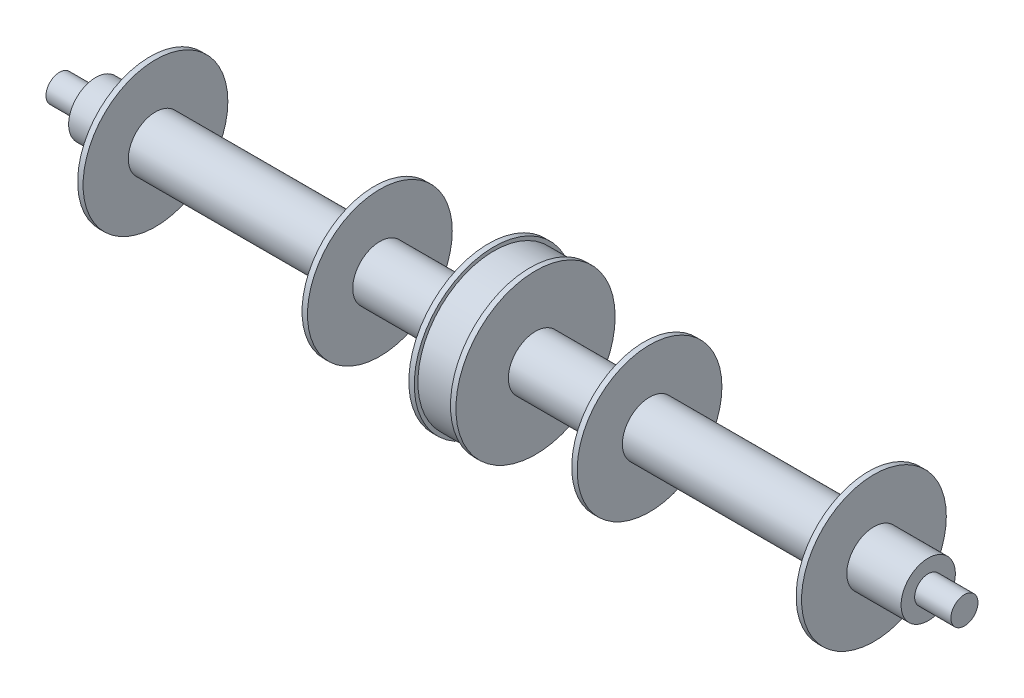
ISO-10303-21;
HEADER;
FILE_DESCRIPTION(('STEP AP214'),'2;1');
FILE_NAME('part.step','',(''),(''),'','','');
FILE_SCHEMA(('AUTOMOTIVE_DESIGN { 1 0 10303 214 1 1 1 1 }'));
ENDSEC;
DATA;
#1=APPLICATION_CONTEXT('core data for automotive mechanical design processes');
#2=APPLICATION_PROTOCOL_DEFINITION('international standard','automotive_design',2000,#1);
#3=PRODUCT_CONTEXT('',#1,'mechanical');
#4=PRODUCT('Part','Part','',(#3));
#5=PRODUCT_RELATED_PRODUCT_CATEGORY('part','',(#4));
#6=PRODUCT_DEFINITION_FORMATION('','',#4);
#7=PRODUCT_DEFINITION_CONTEXT('part definition',#1,'design');
#8=PRODUCT_DEFINITION('design','',#6,#7);
#9=PRODUCT_DEFINITION_SHAPE('','',#8);
#10=(LENGTH_UNIT() NAMED_UNIT(*) SI_UNIT(.MILLI.,.METRE.));
#11=(NAMED_UNIT(*) PLANE_ANGLE_UNIT() SI_UNIT($,.RADIAN.));
#12=(NAMED_UNIT(*) SI_UNIT($,.STERADIAN.) SOLID_ANGLE_UNIT());
#13=UNCERTAINTY_MEASURE_WITH_UNIT(LENGTH_MEASURE(1.E-05),#10,'distance_accuracy_value','');
#14=(GEOMETRIC_REPRESENTATION_CONTEXT(3) GLOBAL_UNCERTAINTY_ASSIGNED_CONTEXT((#13)) GLOBAL_UNIT_ASSIGNED_CONTEXT((#10,
#11,#12)) REPRESENTATION_CONTEXT('',''));
#15=CARTESIAN_POINT('',(0.,0.,0.));
#16=DIRECTION('',(0.,0.,1.));
#17=DIRECTION('',(1.,0.,0.));
#18=AXIS2_PLACEMENT_3D('',#15,#16,#17);
#19=CARTESIAN_POINT('',(125.,0.,0.));
#20=DIRECTION('',(1.,0.,0.));
#21=DIRECTION('',(0.,0.,-1.));
#22=AXIS2_PLACEMENT_3D('',#19,#20,#21);
#23=PLANE('',#22);
#24=CARTESIAN_POINT('',(125.,0.,0.));
#25=DIRECTION('',(1.,0.,0.));
#26=DIRECTION('',(0.,0.,-1.));
#27=AXIS2_PLACEMENT_3D('',#24,#25,#26);
#28=CIRCLE('',#27,3.74999999999999);
#29=CARTESIAN_POINT('',(125.,0.,-3.74999999999999));
#30=VERTEX_POINT('',#29);
#31=EDGE_CURVE('E10',#30,#30,#28,.T.);
#32=ORIENTED_EDGE('',*,*,#31,.T.);
#33=EDGE_LOOP('',(#32));
#34=FACE_BOUND('',#33,.T.);
#35=ADVANCED_FACE('F31',(#34),#23,.T.);
#36=CARTESIAN_POINT('',(-7.95180722891569,0.,0.));
#37=DIRECTION('',(1.,0.,0.));
#38=DIRECTION('',(0.,0.,-1.));
#39=AXIS2_PLACEMENT_3D('',#36,#37,#38);
#40=CYLINDRICAL_SURFACE('',#39,3.74999999999999);
#41=CARTESIAN_POINT('',(115.,0.,0.));
#42=DIRECTION('',(1.,0.,0.));
#43=DIRECTION('',(0.,0.,-1.));
#44=AXIS2_PLACEMENT_3D('',#41,#42,#43);
#45=CIRCLE('',#44,3.74999999999999);
#46=CARTESIAN_POINT('',(115.,0.,-3.74999999999999));
#47=VERTEX_POINT('',#46);
#48=EDGE_CURVE('E37',#47,#47,#45,.T.);
#49=ORIENTED_EDGE('',*,*,#48,.T.);
#50=EDGE_LOOP('',(#49));
#51=FACE_BOUND('',#50,.T.);
#52=ORIENTED_EDGE('',*,*,#31,.F.);
#53=EDGE_LOOP('',(#52));
#54=FACE_BOUND('',#53,.T.);
#55=ADVANCED_FACE('F141',(#51,#54),#40,.T.);
#56=CARTESIAN_POINT('',(115.,3.74999999999999,0.));
#57=DIRECTION('',(1.,0.,0.));
#58=DIRECTION('',(0.,0.,-1.));
#59=AXIS2_PLACEMENT_3D('',#56,#57,#58);
#60=PLANE('',#59);
#61=CARTESIAN_POINT('',(115.,0.,0.));
#62=DIRECTION('',(1.,0.,0.));
#63=DIRECTION('',(0.,0.,-1.));
#64=AXIS2_PLACEMENT_3D('',#61,#62,#63);
#65=CIRCLE('',#64,7.49999999999999);
#66=CARTESIAN_POINT('',(115.,0.,-7.49999999999999));
#67=VERTEX_POINT('',#66);
#68=EDGE_CURVE('E41',#67,#67,#65,.T.);
#69=ORIENTED_EDGE('',*,*,#68,.T.);
#70=EDGE_LOOP('',(#69));
#71=FACE_BOUND('',#70,.T.);
#72=ORIENTED_EDGE('',*,*,#48,.F.);
#73=EDGE_LOOP('',(#72));
#74=FACE_BOUND('',#73,.T.);
#75=ADVANCED_FACE('F145',(#71,#74),#60,.T.);
#76=CARTESIAN_POINT('',(-7.95180722891569,0.,0.));
#77=DIRECTION('',(1.,0.,0.));
#78=DIRECTION('',(0.,0.,-1.));
#79=AXIS2_PLACEMENT_3D('',#76,#77,#78);
#80=CYLINDRICAL_SURFACE('',#79,7.49999999999999);
#81=CARTESIAN_POINT('',(100.,0.,0.));
#82=DIRECTION('',(1.,0.,0.));
#83=DIRECTION('',(0.,0.,-1.));
#84=AXIS2_PLACEMENT_3D('',#81,#82,#83);
#85=CIRCLE('',#84,7.49999999999999);
#86=CARTESIAN_POINT('',(100.,0.,-7.49999999999999));
#87=VERTEX_POINT('',#86);
#88=EDGE_CURVE('E45',#87,#87,#85,.T.);
#89=ORIENTED_EDGE('',*,*,#88,.T.);
#90=EDGE_LOOP('',(#89));
#91=FACE_BOUND('',#90,.T.);
#92=ORIENTED_EDGE('',*,*,#68,.F.);
#93=EDGE_LOOP('',(#92));
#94=FACE_BOUND('',#93,.T.);
#95=ADVANCED_FACE('F149',(#91,#94),#80,.T.);
#96=CARTESIAN_POINT('',(100.,7.49999999999999,0.));
#97=DIRECTION('',(1.,0.,0.));
#98=DIRECTION('',(0.,0.,-1.));
#99=AXIS2_PLACEMENT_3D('',#96,#97,#98);
#100=PLANE('',#99);
#101=CARTESIAN_POINT('',(100.,0.,0.));
#102=DIRECTION('',(1.,0.,0.));
#103=DIRECTION('',(0.,0.,-1.));
#104=AXIS2_PLACEMENT_3D('',#101,#102,#103);
#105=CIRCLE('',#104,20.);
#106=CARTESIAN_POINT('',(100.,0.,-20.));
#107=VERTEX_POINT('',#106);
#108=EDGE_CURVE('E50',#107,#107,#105,.T.);
#109=ORIENTED_EDGE('',*,*,#108,.T.);
#110=EDGE_LOOP('',(#109));
#111=FACE_BOUND('',#110,.T.);
#112=ORIENTED_EDGE('',*,*,#88,.F.);
#113=EDGE_LOOP('',(#112));
#114=FACE_BOUND('',#113,.T.);
#115=ADVANCED_FACE('F156',(#111,#114),#100,.T.);
#116=CARTESIAN_POINT('',(-7.95180722891569,0.,0.));
#117=DIRECTION('',(1.,0.,0.));
#118=DIRECTION('',(0.,0.,-1.));
#119=AXIS2_PLACEMENT_3D('',#116,#117,#118);
#120=CYLINDRICAL_SURFACE('',#119,20.);
#121=CARTESIAN_POINT('',(98.5,0.,0.));
#122=DIRECTION('',(1.,0.,0.));
#123=DIRECTION('',(0.,0.,-1.));
#124=AXIS2_PLACEMENT_3D('',#121,#122,#123);
#125=CIRCLE('',#124,20.);
#126=CARTESIAN_POINT('',(98.5,0.,-20.));
#127=VERTEX_POINT('',#126);
#128=EDGE_CURVE('E53',#127,#127,#125,.T.);
#129=ORIENTED_EDGE('',*,*,#128,.T.);
#130=EDGE_LOOP('',(#129));
#131=FACE_BOUND('',#130,.T.);
#132=ORIENTED_EDGE('',*,*,#108,.F.);
#133=EDGE_LOOP('',(#132));
#134=FACE_BOUND('',#133,.T.);
#135=ADVANCED_FACE('F160',(#131,#134),#120,.T.);
#136=CARTESIAN_POINT('',(98.5,20.,0.));
#137=DIRECTION('',(-1.,0.,0.));
#138=DIRECTION('',(0.,0.,1.));
#139=AXIS2_PLACEMENT_3D('',#136,#137,#138);
#140=PLANE('',#139);
#141=CARTESIAN_POINT('',(98.5,0.,0.));
#142=DIRECTION('',(1.,0.,0.));
#143=DIRECTION('',(0.,0.,-1.));
#144=AXIS2_PLACEMENT_3D('',#141,#142,#143);
#145=CIRCLE('',#144,7.49999999999999);
#146=CARTESIAN_POINT('',(98.5,0.,-7.49999999999999));
#147=VERTEX_POINT('',#146);
#148=EDGE_CURVE('E56',#147,#147,#145,.T.);
#149=ORIENTED_EDGE('',*,*,#148,.T.);
#150=EDGE_LOOP('',(#149));
#151=FACE_BOUND('',#150,.T.);
#152=ORIENTED_EDGE('',*,*,#128,.F.);
#153=EDGE_LOOP('',(#152));
#154=FACE_BOUND('',#153,.T.);
#155=ADVANCED_FACE('F164',(#151,#154),#140,.T.);
#156=CARTESIAN_POINT('',(-7.95180722891569,0.,0.));
#157=DIRECTION('',(1.,0.,0.));
#158=DIRECTION('',(0.,0.,-1.));
#159=AXIS2_PLACEMENT_3D('',#156,#157,#158);
#160=CYLINDRICAL_SURFACE('',#159,7.49999999999999);
#161=CARTESIAN_POINT('',(38.,0.,0.));
#162=DIRECTION('',(1.,0.,0.));
#163=DIRECTION('',(0.,0.,-1.));
#164=AXIS2_PLACEMENT_3D('',#161,#162,#163);
#165=CIRCLE('',#164,7.49999999999999);
#166=CARTESIAN_POINT('',(38.,0.,-7.49999999999999));
#167=VERTEX_POINT('',#166);
#168=EDGE_CURVE('E59',#167,#167,#165,.T.);
#169=ORIENTED_EDGE('',*,*,#168,.T.);
#170=EDGE_LOOP('',(#169));
#171=FACE_BOUND('',#170,.T.);
#172=ORIENTED_EDGE('',*,*,#148,.F.);
#173=EDGE_LOOP('',(#172));
#174=FACE_BOUND('',#173,.T.);
#175=ADVANCED_FACE('F168',(#171,#174),#160,.T.);
#176=CARTESIAN_POINT('',(38.,7.49999999999999,0.));
#177=DIRECTION('',(1.,0.,0.));
#178=DIRECTION('',(0.,0.,-1.));
#179=AXIS2_PLACEMENT_3D('',#176,#177,#178);
#180=PLANE('',#179);
#181=CARTESIAN_POINT('',(38.,0.,0.));
#182=DIRECTION('',(1.,0.,0.));
#183=DIRECTION('',(0.,0.,-1.));
#184=AXIS2_PLACEMENT_3D('',#181,#182,#183);
#185=CIRCLE('',#184,20.);
#186=CARTESIAN_POINT('',(38.,0.,-20.));
#187=VERTEX_POINT('',#186);
#188=EDGE_CURVE('E62',#187,#187,#185,.T.);
#189=ORIENTED_EDGE('',*,*,#188,.T.);
#190=EDGE_LOOP('',(#189));
#191=FACE_BOUND('',#190,.T.);
#192=ORIENTED_EDGE('',*,*,#168,.F.);
#193=EDGE_LOOP('',(#192));
#194=FACE_BOUND('',#193,.T.);
#195=ADVANCED_FACE('F172',(#191,#194),#180,.T.);
#196=CARTESIAN_POINT('',(-7.95180722891569,0.,0.));
#197=DIRECTION('',(1.,0.,0.));
#198=DIRECTION('',(0.,0.,-1.));
#199=AXIS2_PLACEMENT_3D('',#196,#197,#198);
#200=CYLINDRICAL_SURFACE('',#199,20.);
#201=CARTESIAN_POINT('',(36.5,0.,0.));
#202=DIRECTION('',(1.,0.,0.));
#203=DIRECTION('',(0.,0.,-1.));
#204=AXIS2_PLACEMENT_3D('',#201,#202,#203);
#205=CIRCLE('',#204,20.);
#206=CARTESIAN_POINT('',(36.5,0.,-20.));
#207=VERTEX_POINT('',#206);
#208=EDGE_CURVE('E65',#207,#207,#205,.T.);
#209=ORIENTED_EDGE('',*,*,#208,.T.);
#210=EDGE_LOOP('',(#209));
#211=FACE_BOUND('',#210,.T.);
#212=ORIENTED_EDGE('',*,*,#188,.F.);
#213=EDGE_LOOP('',(#212));
#214=FACE_BOUND('',#213,.T.);
#215=ADVANCED_FACE('F176',(#211,#214),#200,.T.);
#216=CARTESIAN_POINT('',(36.5,20.,0.));
#217=DIRECTION('',(-1.,0.,0.));
#218=DIRECTION('',(0.,0.,1.));
#219=AXIS2_PLACEMENT_3D('',#216,#217,#218);
#220=PLANE('',#219);
#221=CARTESIAN_POINT('',(36.5,0.,0.));
#222=DIRECTION('',(1.,0.,0.));
#223=DIRECTION('',(0.,0.,-1.));
#224=AXIS2_PLACEMENT_3D('',#221,#222,#223);
#225=CIRCLE('',#224,7.49999999999999);
#226=CARTESIAN_POINT('',(36.5,0.,-7.49999999999999));
#227=VERTEX_POINT('',#226);
#228=EDGE_CURVE('E68',#227,#227,#225,.T.);
#229=ORIENTED_EDGE('',*,*,#228,.T.);
#230=EDGE_LOOP('',(#229));
#231=FACE_BOUND('',#230,.T.);
#232=ORIENTED_EDGE('',*,*,#208,.F.);
#233=EDGE_LOOP('',(#232));
#234=FACE_BOUND('',#233,.T.);
#235=ADVANCED_FACE('F180',(#231,#234),#220,.T.);
#236=CARTESIAN_POINT('',(-7.95180722891569,0.,0.));
#237=DIRECTION('',(1.,0.,0.));
#238=DIRECTION('',(0.,0.,-1.));
#239=AXIS2_PLACEMENT_3D('',#236,#237,#238);
#240=CYLINDRICAL_SURFACE('',#239,7.49999999999999);
#241=CARTESIAN_POINT('',(6.5,0.,0.));
#242=DIRECTION('',(1.,0.,0.));
#243=DIRECTION('',(0.,0.,-1.));
#244=AXIS2_PLACEMENT_3D('',#241,#242,#243);
#245=CIRCLE('',#244,7.49999999999999);
#246=CARTESIAN_POINT('',(6.5,0.,-7.49999999999999));
#247=VERTEX_POINT('',#246);
#248=EDGE_CURVE('E71',#247,#247,#245,.T.);
#249=ORIENTED_EDGE('',*,*,#248,.T.);
#250=EDGE_LOOP('',(#249));
#251=FACE_BOUND('',#250,.T.);
#252=ORIENTED_EDGE('',*,*,#228,.F.);
#253=EDGE_LOOP('',(#252));
#254=FACE_BOUND('',#253,.T.);
#255=ADVANCED_FACE('F184',(#251,#254),#240,.T.);
#256=CARTESIAN_POINT('',(6.5,7.49999999999999,0.));
#257=DIRECTION('',(1.,0.,0.));
#258=DIRECTION('',(0.,0.,-1.));
#259=AXIS2_PLACEMENT_3D('',#256,#257,#258);
#260=PLANE('',#259);
#261=CARTESIAN_POINT('',(6.5,0.,0.));
#262=DIRECTION('',(1.,0.,0.));
#263=DIRECTION('',(0.,0.,-1.));
#264=AXIS2_PLACEMENT_3D('',#261,#262,#263);
#265=CIRCLE('',#264,21.9999999999999);
#266=CARTESIAN_POINT('',(6.5,0.,-21.9999999999999));
#267=VERTEX_POINT('',#266);
#268=EDGE_CURVE('E74',#267,#267,#265,.T.);
#269=ORIENTED_EDGE('',*,*,#268,.T.);
#270=EDGE_LOOP('',(#269));
#271=FACE_BOUND('',#270,.T.);
#272=ORIENTED_EDGE('',*,*,#248,.F.);
#273=EDGE_LOOP('',(#272));
#274=FACE_BOUND('',#273,.T.);
#275=ADVANCED_FACE('F188',(#271,#274),#260,.T.);
#276=CARTESIAN_POINT('',(-7.95180722891569,0.,0.));
#277=DIRECTION('',(1.,0.,0.));
#278=DIRECTION('',(0.,0.,-1.));
#279=AXIS2_PLACEMENT_3D('',#276,#277,#278);
#280=CYLINDRICAL_SURFACE('',#279,21.9999999999999);
#281=CARTESIAN_POINT('',(5.,0.,0.));
#282=DIRECTION('',(1.,0.,0.));
#283=DIRECTION('',(0.,0.,-1.));
#284=AXIS2_PLACEMENT_3D('',#281,#282,#283);
#285=CIRCLE('',#284,21.9999999999999);
#286=CARTESIAN_POINT('',(5.,0.,-21.9999999999999));
#287=VERTEX_POINT('',#286);
#288=EDGE_CURVE('E77',#287,#287,#285,.T.);
#289=ORIENTED_EDGE('',*,*,#288,.T.);
#290=EDGE_LOOP('',(#289));
#291=FACE_BOUND('',#290,.T.);
#292=ORIENTED_EDGE('',*,*,#268,.F.);
#293=EDGE_LOOP('',(#292));
#294=FACE_BOUND('',#293,.T.);
#295=ADVANCED_FACE('F192',(#291,#294),#280,.T.);
#296=CARTESIAN_POINT('',(5.,21.9999999999999,0.));
#297=DIRECTION('',(-1.,0.,0.));
#298=DIRECTION('',(0.,0.,1.));
#299=AXIS2_PLACEMENT_3D('',#296,#297,#298);
#300=PLANE('',#299);
#301=CARTESIAN_POINT('',(5.,0.,0.));
#302=DIRECTION('',(1.,0.,0.));
#303=DIRECTION('',(0.,0.,-1.));
#304=AXIS2_PLACEMENT_3D('',#301,#302,#303);
#305=CIRCLE('',#304,20.9999999999999);
#306=CARTESIAN_POINT('',(5.,0.,-20.9999999999999));
#307=VERTEX_POINT('',#306);
#308=EDGE_CURVE('E80',#307,#307,#305,.T.);
#309=ORIENTED_EDGE('',*,*,#308,.T.);
#310=EDGE_LOOP('',(#309));
#311=FACE_BOUND('',#310,.T.);
#312=ORIENTED_EDGE('',*,*,#288,.F.);
#313=EDGE_LOOP('',(#312));
#314=FACE_BOUND('',#313,.T.);
#315=ADVANCED_FACE('F196',(#311,#314),#300,.T.);
#316=CARTESIAN_POINT('',(-7.95180722891569,0.,0.));
#317=DIRECTION('',(1.,0.,0.));
#318=DIRECTION('',(0.,0.,-1.));
#319=AXIS2_PLACEMENT_3D('',#316,#317,#318);
#320=CYLINDRICAL_SURFACE('',#319,20.9999999999999);
#321=CARTESIAN_POINT('',(-5.,0.,0.));
#322=DIRECTION('',(1.,0.,0.));
#323=DIRECTION('',(0.,0.,-1.));
#324=AXIS2_PLACEMENT_3D('',#321,#322,#323);
#325=CIRCLE('',#324,20.9999999999999);
#326=CARTESIAN_POINT('',(-5.,0.,-20.9999999999999));
#327=VERTEX_POINT('',#326);
#328=EDGE_CURVE('E83',#327,#327,#325,.T.);
#329=ORIENTED_EDGE('',*,*,#328,.T.);
#330=EDGE_LOOP('',(#329));
#331=FACE_BOUND('',#330,.T.);
#332=ORIENTED_EDGE('',*,*,#308,.F.);
#333=EDGE_LOOP('',(#332));
#334=FACE_BOUND('',#333,.T.);
#335=ADVANCED_FACE('F200',(#331,#334),#320,.T.);
#336=CARTESIAN_POINT('',(-5.,21.9999999999999,0.));
#337=DIRECTION('',(1.,0.,0.));
#338=DIRECTION('',(0.,0.,-1.));
#339=AXIS2_PLACEMENT_3D('',#336,#337,#338);
#340=PLANE('',#339);
#341=CARTESIAN_POINT('',(-5.,0.,0.));
#342=DIRECTION('',(1.,0.,0.));
#343=DIRECTION('',(0.,0.,-1.));
#344=AXIS2_PLACEMENT_3D('',#341,#342,#343);
#345=CIRCLE('',#344,21.9999999999999);
#346=CARTESIAN_POINT('',(-5.,0.,-21.9999999999999));
#347=VERTEX_POINT('',#346);
#348=EDGE_CURVE('E86',#347,#347,#345,.T.);
#349=ORIENTED_EDGE('',*,*,#348,.T.);
#350=EDGE_LOOP('',(#349));
#351=FACE_BOUND('',#350,.T.);
#352=ORIENTED_EDGE('',*,*,#328,.F.);
#353=EDGE_LOOP('',(#352));
#354=FACE_BOUND('',#353,.T.);
#355=ADVANCED_FACE('F204',(#351,#354),#340,.T.);
#356=CARTESIAN_POINT('',(-7.95180722891569,0.,0.));
#357=DIRECTION('',(1.,0.,0.));
#358=DIRECTION('',(0.,0.,-1.));
#359=AXIS2_PLACEMENT_3D('',#356,#357,#358);
#360=CYLINDRICAL_SURFACE('',#359,21.9999999999999);
#361=CARTESIAN_POINT('',(-6.5,0.,0.));
#362=DIRECTION('',(1.,0.,0.));
#363=DIRECTION('',(0.,0.,-1.));
#364=AXIS2_PLACEMENT_3D('',#361,#362,#363);
#365=CIRCLE('',#364,21.9999999999999);
#366=CARTESIAN_POINT('',(-6.5,0.,-21.9999999999999));
#367=VERTEX_POINT('',#366);
#368=EDGE_CURVE('E89',#367,#367,#365,.T.);
#369=ORIENTED_EDGE('',*,*,#368,.T.);
#370=EDGE_LOOP('',(#369));
#371=FACE_BOUND('',#370,.T.);
#372=ORIENTED_EDGE('',*,*,#348,.F.);
#373=EDGE_LOOP('',(#372));
#374=FACE_BOUND('',#373,.T.);
#375=ADVANCED_FACE('F208',(#371,#374),#360,.T.);
#376=CARTESIAN_POINT('',(-6.5,7.49999999999999,0.));
#377=DIRECTION('',(-1.,0.,0.));
#378=DIRECTION('',(0.,0.,1.));
#379=AXIS2_PLACEMENT_3D('',#376,#377,#378);
#380=PLANE('',#379);
#381=CARTESIAN_POINT('',(-6.5,0.,0.));
#382=DIRECTION('',(1.,0.,0.));
#383=DIRECTION('',(0.,0.,-1.));
#384=AXIS2_PLACEMENT_3D('',#381,#382,#383);
#385=CIRCLE('',#384,7.49999999999999);
#386=CARTESIAN_POINT('',(-6.5,0.,-7.49999999999999));
#387=VERTEX_POINT('',#386);
#388=EDGE_CURVE('E92',#387,#387,#385,.T.);
#389=ORIENTED_EDGE('',*,*,#388,.T.);
#390=EDGE_LOOP('',(#389));
#391=FACE_BOUND('',#390,.T.);
#392=ORIENTED_EDGE('',*,*,#368,.F.);
#393=EDGE_LOOP('',(#392));
#394=FACE_BOUND('',#393,.T.);
#395=ADVANCED_FACE('F212',(#391,#394),#380,.T.);
#396=CARTESIAN_POINT('',(-7.95180722891569,0.,0.));
#397=DIRECTION('',(1.,0.,0.));
#398=DIRECTION('',(0.,0.,-1.));
#399=AXIS2_PLACEMENT_3D('',#396,#397,#398);
#400=CYLINDRICAL_SURFACE('',#399,7.49999999999999);
#401=CARTESIAN_POINT('',(-36.5,0.,0.));
#402=DIRECTION('',(1.,0.,0.));
#403=DIRECTION('',(0.,0.,-1.));
#404=AXIS2_PLACEMENT_3D('',#401,#402,#403);
#405=CIRCLE('',#404,7.49999999999999);
#406=CARTESIAN_POINT('',(-36.5,0.,-7.49999999999999));
#407=VERTEX_POINT('',#406);
#408=EDGE_CURVE('E95',#407,#407,#405,.T.);
#409=ORIENTED_EDGE('',*,*,#408,.T.);
#410=EDGE_LOOP('',(#409));
#411=FACE_BOUND('',#410,.T.);
#412=ORIENTED_EDGE('',*,*,#388,.F.);
#413=EDGE_LOOP('',(#412));
#414=FACE_BOUND('',#413,.T.);
#415=ADVANCED_FACE('F216',(#411,#414),#400,.T.);
#416=CARTESIAN_POINT('',(-36.5,20.,0.));
#417=DIRECTION('',(1.,0.,0.));
#418=DIRECTION('',(0.,0.,-1.));
#419=AXIS2_PLACEMENT_3D('',#416,#417,#418);
#420=PLANE('',#419);
#421=CARTESIAN_POINT('',(-36.5,0.,0.));
#422=DIRECTION('',(1.,0.,0.));
#423=DIRECTION('',(0.,0.,-1.));
#424=AXIS2_PLACEMENT_3D('',#421,#422,#423);
#425=CIRCLE('',#424,20.);
#426=CARTESIAN_POINT('',(-36.5,0.,-20.));
#427=VERTEX_POINT('',#426);
#428=EDGE_CURVE('E98',#427,#427,#425,.T.);
#429=ORIENTED_EDGE('',*,*,#428,.T.);
#430=EDGE_LOOP('',(#429));
#431=FACE_BOUND('',#430,.T.);
#432=ORIENTED_EDGE('',*,*,#408,.F.);
#433=EDGE_LOOP('',(#432));
#434=FACE_BOUND('',#433,.T.);
#435=ADVANCED_FACE('F220',(#431,#434),#420,.T.);
#436=CARTESIAN_POINT('',(-7.95180722891569,0.,0.));
#437=DIRECTION('',(1.,0.,0.));
#438=DIRECTION('',(0.,0.,-1.));
#439=AXIS2_PLACEMENT_3D('',#436,#437,#438);
#440=CYLINDRICAL_SURFACE('',#439,20.);
#441=CARTESIAN_POINT('',(-38.,0.,0.));
#442=DIRECTION('',(1.,0.,0.));
#443=DIRECTION('',(0.,0.,-1.));
#444=AXIS2_PLACEMENT_3D('',#441,#442,#443);
#445=CIRCLE('',#444,20.);
#446=CARTESIAN_POINT('',(-38.,0.,-20.));
#447=VERTEX_POINT('',#446);
#448=EDGE_CURVE('E101',#447,#447,#445,.T.);
#449=ORIENTED_EDGE('',*,*,#448,.T.);
#450=EDGE_LOOP('',(#449));
#451=FACE_BOUND('',#450,.T.);
#452=ORIENTED_EDGE('',*,*,#428,.F.);
#453=EDGE_LOOP('',(#452));
#454=FACE_BOUND('',#453,.T.);
#455=ADVANCED_FACE('F224',(#451,#454),#440,.T.);
#456=CARTESIAN_POINT('',(-38.,7.49999999999999,0.));
#457=DIRECTION('',(-1.,0.,0.));
#458=DIRECTION('',(0.,0.,1.));
#459=AXIS2_PLACEMENT_3D('',#456,#457,#458);
#460=PLANE('',#459);
#461=CARTESIAN_POINT('',(-38.,0.,0.));
#462=DIRECTION('',(1.,0.,0.));
#463=DIRECTION('',(0.,0.,-1.));
#464=AXIS2_PLACEMENT_3D('',#461,#462,#463);
#465=CIRCLE('',#464,7.49999999999999);
#466=CARTESIAN_POINT('',(-38.,0.,-7.49999999999999));
#467=VERTEX_POINT('',#466);
#468=EDGE_CURVE('E104',#467,#467,#465,.T.);
#469=ORIENTED_EDGE('',*,*,#468,.T.);
#470=EDGE_LOOP('',(#469));
#471=FACE_BOUND('',#470,.T.);
#472=ORIENTED_EDGE('',*,*,#448,.F.);
#473=EDGE_LOOP('',(#472));
#474=FACE_BOUND('',#473,.T.);
#475=ADVANCED_FACE('F228',(#471,#474),#460,.T.);
#476=CARTESIAN_POINT('',(-7.95180722891569,0.,0.));
#477=DIRECTION('',(1.,0.,0.));
#478=DIRECTION('',(0.,0.,-1.));
#479=AXIS2_PLACEMENT_3D('',#476,#477,#478);
#480=CYLINDRICAL_SURFACE('',#479,7.49999999999999);
#481=CARTESIAN_POINT('',(-98.5,0.,0.));
#482=DIRECTION('',(1.,0.,0.));
#483=DIRECTION('',(0.,0.,-1.));
#484=AXIS2_PLACEMENT_3D('',#481,#482,#483);
#485=CIRCLE('',#484,7.49999999999999);
#486=CARTESIAN_POINT('',(-98.5,0.,-7.49999999999999));
#487=VERTEX_POINT('',#486);
#488=EDGE_CURVE('E107',#487,#487,#485,.T.);
#489=ORIENTED_EDGE('',*,*,#488,.T.);
#490=EDGE_LOOP('',(#489));
#491=FACE_BOUND('',#490,.T.);
#492=ORIENTED_EDGE('',*,*,#468,.F.);
#493=EDGE_LOOP('',(#492));
#494=FACE_BOUND('',#493,.T.);
#495=ADVANCED_FACE('F232',(#491,#494),#480,.T.);
#496=CARTESIAN_POINT('',(-98.5,20.,0.));
#497=DIRECTION('',(1.,0.,0.));
#498=DIRECTION('',(0.,0.,-1.));
#499=AXIS2_PLACEMENT_3D('',#496,#497,#498);
#500=PLANE('',#499);
#501=CARTESIAN_POINT('',(-98.5,0.,0.));
#502=DIRECTION('',(1.,0.,0.));
#503=DIRECTION('',(0.,0.,-1.));
#504=AXIS2_PLACEMENT_3D('',#501,#502,#503);
#505=CIRCLE('',#504,20.);
#506=CARTESIAN_POINT('',(-98.5,0.,-20.));
#507=VERTEX_POINT('',#506);
#508=EDGE_CURVE('E110',#507,#507,#505,.T.);
#509=ORIENTED_EDGE('',*,*,#508,.T.);
#510=EDGE_LOOP('',(#509));
#511=FACE_BOUND('',#510,.T.);
#512=ORIENTED_EDGE('',*,*,#488,.F.);
#513=EDGE_LOOP('',(#512));
#514=FACE_BOUND('',#513,.T.);
#515=ADVANCED_FACE('F236',(#511,#514),#500,.T.);
#516=CARTESIAN_POINT('',(-7.95180722891569,0.,0.));
#517=DIRECTION('',(1.,0.,0.));
#518=DIRECTION('',(0.,0.,-1.));
#519=AXIS2_PLACEMENT_3D('',#516,#517,#518);
#520=CYLINDRICAL_SURFACE('',#519,20.);
#521=CARTESIAN_POINT('',(-100.,0.,0.));
#522=DIRECTION('',(1.,0.,0.));
#523=DIRECTION('',(0.,0.,-1.));
#524=AXIS2_PLACEMENT_3D('',#521,#522,#523);
#525=CIRCLE('',#524,20.);
#526=CARTESIAN_POINT('',(-100.,0.,-20.));
#527=VERTEX_POINT('',#526);
#528=EDGE_CURVE('E113',#527,#527,#525,.T.);
#529=ORIENTED_EDGE('',*,*,#528,.T.);
#530=EDGE_LOOP('',(#529));
#531=FACE_BOUND('',#530,.T.);
#532=ORIENTED_EDGE('',*,*,#508,.F.);
#533=EDGE_LOOP('',(#532));
#534=FACE_BOUND('',#533,.T.);
#535=ADVANCED_FACE('F240',(#531,#534),#520,.T.);
#536=CARTESIAN_POINT('',(-100.,7.49999999999999,0.));
#537=DIRECTION('',(-1.,0.,0.));
#538=DIRECTION('',(0.,0.,1.));
#539=AXIS2_PLACEMENT_3D('',#536,#537,#538);
#540=PLANE('',#539);
#541=CARTESIAN_POINT('',(-100.,0.,0.));
#542=DIRECTION('',(1.,0.,0.));
#543=DIRECTION('',(0.,0.,-1.));
#544=AXIS2_PLACEMENT_3D('',#541,#542,#543);
#545=CIRCLE('',#544,7.49999999999999);
#546=CARTESIAN_POINT('',(-100.,0.,-7.49999999999999));
#547=VERTEX_POINT('',#546);
#548=EDGE_CURVE('E116',#547,#547,#545,.T.);
#549=ORIENTED_EDGE('',*,*,#548,.T.);
#550=EDGE_LOOP('',(#549));
#551=FACE_BOUND('',#550,.T.);
#552=ORIENTED_EDGE('',*,*,#528,.F.);
#553=EDGE_LOOP('',(#552));
#554=FACE_BOUND('',#553,.T.);
#555=ADVANCED_FACE('F244',(#551,#554),#540,.T.);
#556=CARTESIAN_POINT('',(-7.95180722891569,0.,0.));
#557=DIRECTION('',(1.,0.,0.));
#558=DIRECTION('',(0.,0.,-1.));
#559=AXIS2_PLACEMENT_3D('',#556,#557,#558);
#560=CYLINDRICAL_SURFACE('',#559,7.49999999999999);
#561=CARTESIAN_POINT('',(-115.,0.,0.));
#562=DIRECTION('',(1.,0.,0.));
#563=DIRECTION('',(0.,0.,-1.));
#564=AXIS2_PLACEMENT_3D('',#561,#562,#563);
#565=CIRCLE('',#564,7.49999999999999);
#566=CARTESIAN_POINT('',(-115.,0.,-7.49999999999999));
#567=VERTEX_POINT('',#566);
#568=EDGE_CURVE('E119',#567,#567,#565,.T.);
#569=ORIENTED_EDGE('',*,*,#568,.T.);
#570=EDGE_LOOP('',(#569));
#571=FACE_BOUND('',#570,.T.);
#572=ORIENTED_EDGE('',*,*,#548,.F.);
#573=EDGE_LOOP('',(#572));
#574=FACE_BOUND('',#573,.T.);
#575=ADVANCED_FACE('F248',(#571,#574),#560,.T.);
#576=CARTESIAN_POINT('',(-115.,3.74999999999999,0.));
#577=DIRECTION('',(-1.,0.,0.));
#578=DIRECTION('',(0.,0.,1.));
#579=AXIS2_PLACEMENT_3D('',#576,#577,#578);
#580=PLANE('',#579);
#581=CARTESIAN_POINT('',(-115.,0.,0.));
#582=DIRECTION('',(1.,0.,0.));
#583=DIRECTION('',(0.,0.,-1.));
#584=AXIS2_PLACEMENT_3D('',#581,#582,#583);
#585=CIRCLE('',#584,3.74999999999999);
#586=CARTESIAN_POINT('',(-115.,0.,-3.74999999999999));
#587=VERTEX_POINT('',#586);
#588=EDGE_CURVE('E122',#587,#587,#585,.T.);
#589=ORIENTED_EDGE('',*,*,#588,.T.);
#590=EDGE_LOOP('',(#589));
#591=FACE_BOUND('',#590,.T.);
#592=ORIENTED_EDGE('',*,*,#568,.F.);
#593=EDGE_LOOP('',(#592));
#594=FACE_BOUND('',#593,.T.);
#595=ADVANCED_FACE('F138',(#591,#594),#580,.T.);
#596=CARTESIAN_POINT('',(-7.95180722891569,0.,0.));
#597=DIRECTION('',(1.,0.,0.));
#598=DIRECTION('',(0.,0.,-1.));
#599=AXIS2_PLACEMENT_3D('',#596,#597,#598);
#600=CYLINDRICAL_SURFACE('',#599,3.74999999999999);
#601=CARTESIAN_POINT('',(-125.,0.,0.));
#602=DIRECTION('',(1.,0.,0.));
#603=DIRECTION('',(0.,0.,-1.));
#604=AXIS2_PLACEMENT_3D('',#601,#602,#603);
#605=CIRCLE('',#604,3.74999999999999);
#606=CARTESIAN_POINT('',(-125.,0.,-3.74999999999999));
#607=VERTEX_POINT('',#606);
#608=EDGE_CURVE('E125',#607,#607,#605,.T.);
#609=ORIENTED_EDGE('',*,*,#608,.T.);
#610=EDGE_LOOP('',(#609));
#611=FACE_BOUND('',#610,.T.);
#612=ORIENTED_EDGE('',*,*,#588,.F.);
#613=EDGE_LOOP('',(#612));
#614=FACE_BOUND('',#613,.T.);
#615=ADVANCED_FACE('F129',(#611,#614),#600,.T.);
#616=CARTESIAN_POINT('',(-125.,0.,0.));
#617=DIRECTION('',(-1.,0.,0.));
#618=DIRECTION('',(0.,0.,1.));
#619=AXIS2_PLACEMENT_3D('',#616,#617,#618);
#620=PLANE('',#619);
#621=ORIENTED_EDGE('',*,*,#608,.F.);
#622=EDGE_LOOP('',(#621));
#623=FACE_BOUND('',#622,.T.);
#624=ADVANCED_FACE('F132',(#623),#620,.T.);
#625=CLOSED_SHELL('',(#35,#55,#75,#95,#115,#135,#155,#175,#195,#215,#235,#255,#275,#295,#315,
#335,#355,#375,#395,#415,#435,#455,#475,#495,#515,#535,#555,#575,#595,#615,#624));
#626=MANIFOLD_SOLID_BREP('B2',#625);
#627=ADVANCED_BREP_SHAPE_REPRESENTATION('',(#18,#626),#14);
#628=SHAPE_DEFINITION_REPRESENTATION(#9,#627);
ENDSEC;
END-ISO-10303-21;
